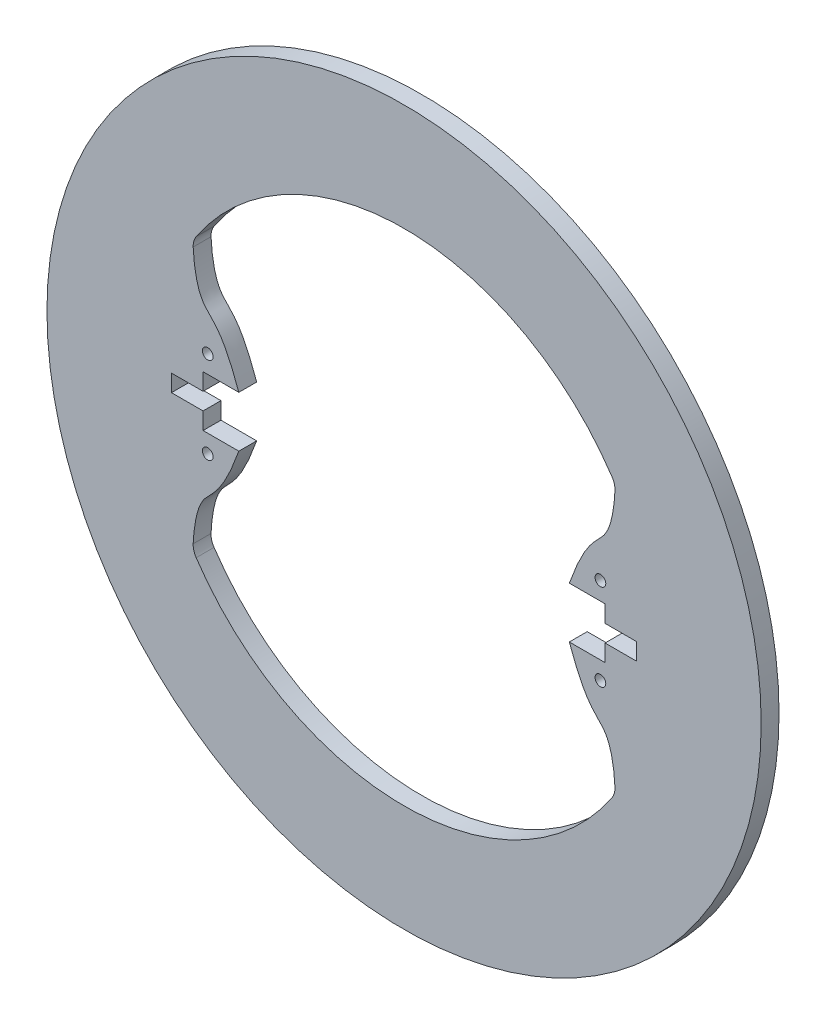
ISO-10303-21;
HEADER;
FILE_DESCRIPTION(('STEP AP214'),'2;1');
FILE_NAME('part.step','',(''),(''),'','','');
FILE_SCHEMA(('AUTOMOTIVE_DESIGN { 1 0 10303 214 1 1 1 1 }'));
ENDSEC;
DATA;
#1=APPLICATION_CONTEXT('core data for automotive mechanical design processes');
#2=APPLICATION_PROTOCOL_DEFINITION('international standard','automotive_design',2000,#1);
#3=PRODUCT_CONTEXT('',#1,'mechanical');
#4=PRODUCT('Part','Part','',(#3));
#5=PRODUCT_RELATED_PRODUCT_CATEGORY('part','',(#4));
#6=PRODUCT_DEFINITION_FORMATION('','',#4);
#7=PRODUCT_DEFINITION_CONTEXT('part definition',#1,'design');
#8=PRODUCT_DEFINITION('design','',#6,#7);
#9=PRODUCT_DEFINITION_SHAPE('','',#8);
#10=(LENGTH_UNIT() NAMED_UNIT(*) SI_UNIT(.MILLI.,.METRE.));
#11=(NAMED_UNIT(*) PLANE_ANGLE_UNIT() SI_UNIT($,.RADIAN.));
#12=(NAMED_UNIT(*) SI_UNIT($,.STERADIAN.) SOLID_ANGLE_UNIT());
#13=UNCERTAINTY_MEASURE_WITH_UNIT(LENGTH_MEASURE(1.E-05),#10,'distance_accuracy_value','');
#14=(GEOMETRIC_REPRESENTATION_CONTEXT(3) GLOBAL_UNCERTAINTY_ASSIGNED_CONTEXT((#13)) GLOBAL_UNIT_ASSIGNED_CONTEXT((#10,
#11,#12)) REPRESENTATION_CONTEXT('',''));
#15=CARTESIAN_POINT('',(0.,0.,0.));
#16=DIRECTION('',(0.,0.,1.));
#17=DIRECTION('',(1.,0.,0.));
#18=AXIS2_PLACEMENT_3D('',#15,#16,#17);
#19=CARTESIAN_POINT('',(0.,0.,5.));
#20=DIRECTION('',(0.,0.,1.));
#21=DIRECTION('',(1.,0.,0.));
#22=AXIS2_PLACEMENT_3D('',#19,#20,#21);
#23=PLANE('',#22);
#24=CARTESIAN_POINT('',(-54.9519052838332,-12.125,5.));
#25=DIRECTION('',(0.,0.,-1.));
#26=DIRECTION('',(-1.,0.,0.));
#27=AXIS2_PLACEMENT_3D('',#24,#25,#26);
#28=CIRCLE('',#27,1.5);
#29=CARTESIAN_POINT('',(-56.4519052838332,-12.125,5.));
#30=VERTEX_POINT('',#29);
#31=EDGE_CURVE('E310',#30,#30,#28,.T.);
#32=ORIENTED_EDGE('',*,*,#31,.T.);
#33=EDGE_LOOP('',(#32));
#34=FACE_BOUND('',#33,.T.);
#35=CARTESIAN_POINT('',(-54.9519052838332,12.125,5.));
#36=DIRECTION('',(0.,0.,1.));
#37=DIRECTION('',(1.,0.,0.));
#38=AXIS2_PLACEMENT_3D('',#35,#36,#37);
#39=CIRCLE('',#38,1.5);
#40=CARTESIAN_POINT('',(-53.4519052838332,12.125,5.));
#41=VERTEX_POINT('',#40);
#42=EDGE_CURVE('E308',#41,#41,#39,.T.);
#43=ORIENTED_EDGE('',*,*,#42,.F.);
#44=EDGE_LOOP('',(#43));
#45=FACE_BOUND('',#44,.T.);
#46=CARTESIAN_POINT('',(0.,0.,5.));
#47=DIRECTION('',(0.,0.,1.));
#48=DIRECTION('',(1.,0.,0.));
#49=AXIS2_PLACEMENT_3D('',#46,#47,#48);
#50=CIRCLE('',#49,99.95);
#51=CARTESIAN_POINT('',(99.95,0.,5.));
#52=VERTEX_POINT('',#51);
#53=EDGE_CURVE('E11',#52,#52,#50,.T.);
#54=ORIENTED_EDGE('',*,*,#53,.T.);
#55=EDGE_LOOP('',(#54));
#56=FACE_BOUND('',#55,.T.);
#57=DIRECTION('',(-1.,0.,0.));
#58=VECTOR('',#57,1.);
#59=CARTESIAN_POINT('',(-56.2500000000002,2.375,5.));
#60=LINE('',#59,#58);
#61=CARTESIAN_POINT('',(-56.2500000000002,2.375,5.));
#62=VERTEX_POINT('',#61);
#63=CARTESIAN_POINT('',(-65.1000000000003,2.375,5.));
#64=VERTEX_POINT('',#63);
#65=EDGE_CURVE('E209',#62,#64,#60,.T.);
#66=ORIENTED_EDGE('',*,*,#65,.F.);
#67=DIRECTION('',(0.,-1.,0.));
#68=VECTOR('',#67,1.);
#69=CARTESIAN_POINT('',(-56.2500000000002,7.125,5.));
#70=LINE('',#69,#68);
#71=CARTESIAN_POINT('',(-56.2500000000002,7.125,5.));
#72=VERTEX_POINT('',#71);
#73=EDGE_CURVE('E201',#72,#62,#70,.T.);
#74=ORIENTED_EDGE('',*,*,#73,.F.);
#75=DIRECTION('',(-1.,0.,0.));
#76=VECTOR('',#75,1.);
#77=CARTESIAN_POINT('',(-56.2500000000002,7.125,5.));
#78=LINE('',#77,#76);
#79=CARTESIAN_POINT('',(-46.25,7.125,5.));
#80=VERTEX_POINT('',#79);
#81=EDGE_CURVE('E356',#80,#72,#78,.T.);
#82=ORIENTED_EDGE('',*,*,#81,.F.);
#83=CARTESIAN_POINT('',(-59.0263284799365,35.9670995706472,5.));
#84=CARTESIAN_POINT('',(-58.7951174998396,29.1461096697323,5.));
#85=CARTESIAN_POINT('',(-56.2893390197397,16.9349751537397,5.));
#86=CARTESIAN_POINT('',(-53.9936810278316,28.8237446982578,5.));
#87=CARTESIAN_POINT('',(-46.25,7.125,5.));
#88=B_SPLINE_CURVE_WITH_KNOTS('',4,(#83,#84,#85,#86,#87),.UNSPECIFIED.,.F.,.F.,(5,5),(0.,1.),.UNSPECIFIED.);
#89=CARTESIAN_POINT('',(-59.0263284799365,35.9670995706472,5.));
#90=VERTEX_POINT('',#89);
#91=EDGE_CURVE('E350',#90,#80,#88,.T.);
#92=ORIENTED_EDGE('',*,*,#91,.F.);
#93=CARTESIAN_POINT('',(-54.0291985205795,36.1364872009411,5.));
#94=DIRECTION('',(0.,0.,1.));
#95=DIRECTION('',(1.,0.,0.));
#96=AXIS2_PLACEMENT_3D('',#93,#94,#95);
#97=CIRCLE('',#96,4.99999999999999);
#98=CARTESIAN_POINT('',(-58.1852907144704,38.9162169856289,5.));
#99=VERTEX_POINT('',#98);
#100=EDGE_CURVE('E357',#99,#90,#97,.T.);
#101=ORIENTED_EDGE('',*,*,#100,.F.);
#102=CARTESIAN_POINT('',(0.,0.,5.));
#103=DIRECTION('',(0.,0.,1.));
#104=DIRECTION('',(1.,0.,0.));
#105=AXIS2_PLACEMENT_3D('',#102,#103,#104);
#106=CIRCLE('',#105,70.);
#107=CARTESIAN_POINT('',(58.1852907144702,38.9162169856296,5.));
#108=VERTEX_POINT('',#107);
#109=EDGE_CURVE('E587',#108,#99,#106,.T.);
#110=ORIENTED_EDGE('',*,*,#109,.F.);
#111=CARTESIAN_POINT('',(54.0291985205795,36.1364872009418,5.));
#112=DIRECTION('',(0.,0.,1.));
#113=DIRECTION('',(-1.,0.,0.));
#114=AXIS2_PLACEMENT_3D('',#111,#112,#113);
#115=CIRCLE('',#114,4.99999999999999);
#116=CARTESIAN_POINT('',(59.0263284799365,35.967099570648,5.));
#117=VERTEX_POINT('',#116);
#118=EDGE_CURVE('E576',#117,#108,#115,.T.);
#119=ORIENTED_EDGE('',*,*,#118,.F.);
#120=CARTESIAN_POINT('',(46.2500000000004,7.12500000000064,5.));
#121=CARTESIAN_POINT('',(53.9936810278317,28.8237446982585,5.));
#122=CARTESIAN_POINT('',(56.28933901974,16.9349751537405,5.));
#123=CARTESIAN_POINT('',(58.7951174998397,29.1461096697332,5.));
#124=CARTESIAN_POINT('',(59.0263284799365,35.967099570648,5.));
#125=B_SPLINE_CURVE_WITH_KNOTS('',4,(#120,#121,#122,#123,#124),.UNSPECIFIED.,.F.,.F.,(5,5),(0.,
1.),.UNSPECIFIED.);
#126=CARTESIAN_POINT('',(46.2500000000004,7.12500000000064,5.));
#127=VERTEX_POINT('',#126);
#128=EDGE_CURVE('E570',#127,#117,#125,.T.);
#129=ORIENTED_EDGE('',*,*,#128,.F.);
#130=DIRECTION('',(-1.,0.,0.));
#131=VECTOR('',#130,1.);
#132=CARTESIAN_POINT('',(56.2500000000006,7.12500000000078,5.));
#133=LINE('',#132,#131);
#134=CARTESIAN_POINT('',(56.2500000000006,7.12500000000078,5.));
#135=VERTEX_POINT('',#134);
#136=EDGE_CURVE('E594',#135,#127,#133,.T.);
#137=ORIENTED_EDGE('',*,*,#136,.F.);
#138=DIRECTION('',(0.,1.,0.));
#139=VECTOR('',#138,1.);
#140=CARTESIAN_POINT('',(56.2500000000006,7.12500000000078,5.));
#141=LINE('',#140,#139);
#142=CARTESIAN_POINT('',(56.2500000000007,2.37500000000078,5.));
#143=VERTEX_POINT('',#142);
#144=EDGE_CURVE('E559',#143,#135,#141,.T.);
#145=ORIENTED_EDGE('',*,*,#144,.F.);
#146=DIRECTION('',(-1.,0.,0.));
#147=VECTOR('',#146,1.);
#148=CARTESIAN_POINT('',(56.2500000000007,2.37500000000078,5.));
#149=LINE('',#148,#147);
#150=CARTESIAN_POINT('',(65.1000000000007,2.37500000000092,5.));
#151=VERTEX_POINT('',#150);
#152=EDGE_CURVE('E553',#151,#143,#149,.T.);
#153=ORIENTED_EDGE('',*,*,#152,.F.);
#154=DIRECTION('',(0.,1.,0.));
#155=VECTOR('',#154,1.);
#156=CARTESIAN_POINT('',(65.1000000000007,2.37500000000092,5.));
#157=LINE('',#156,#155);
#158=CARTESIAN_POINT('',(65.1000000000007,-2.37500000000091,5.));
#159=VERTEX_POINT('',#158);
#160=EDGE_CURVE('E632',#159,#151,#157,.T.);
#161=ORIENTED_EDGE('',*,*,#160,.F.);
#162=DIRECTION('',(1.,0.,0.));
#163=VECTOR('',#162,1.);
#164=CARTESIAN_POINT('',(56.2500000000007,-2.37500000000078,5.));
#165=LINE('',#164,#163);
#166=CARTESIAN_POINT('',(56.2500000000007,-2.37500000000078,5.));
#167=VERTEX_POINT('',#166);
#168=EDGE_CURVE('E542',#167,#159,#165,.T.);
#169=ORIENTED_EDGE('',*,*,#168,.F.);
#170=DIRECTION('',(0.,1.,0.));
#171=VECTOR('',#170,1.);
#172=CARTESIAN_POINT('',(56.2500000000006,-7.12500000000078,5.));
#173=LINE('',#172,#171);
#174=CARTESIAN_POINT('',(56.2500000000006,-7.12500000000078,5.));
#175=VERTEX_POINT('',#174);
#176=EDGE_CURVE('E536',#175,#167,#173,.T.);
#177=ORIENTED_EDGE('',*,*,#176,.F.);
#178=DIRECTION('',(1.,0.,0.));
#179=VECTOR('',#178,1.);
#180=CARTESIAN_POINT('',(56.2500000000006,-7.12500000000078,5.));
#181=LINE('',#180,#179);
#182=CARTESIAN_POINT('',(46.2500000000004,-7.12500000000064,5.));
#183=VERTEX_POINT('',#182);
#184=EDGE_CURVE('E625',#183,#175,#181,.T.);
#185=ORIENTED_EDGE('',*,*,#184,.F.);
#186=CARTESIAN_POINT('',(59.0263284799365,-35.967099570648,5.));
#187=CARTESIAN_POINT('',(58.7951174998397,-29.1461096697332,5.));
#188=CARTESIAN_POINT('',(56.28933901974,-16.9349751537405,5.));
#189=CARTESIAN_POINT('',(53.9936810278317,-28.8237446982585,5.));
#190=CARTESIAN_POINT('',(46.2500000000004,-7.12500000000064,5.));
#191=B_SPLINE_CURVE_WITH_KNOTS('',4,(#186,#187,#188,#189,#190),.UNSPECIFIED.,.F.,.F.,(5,5),(0.,
1.),.UNSPECIFIED.);
#192=CARTESIAN_POINT('',(59.0263284799365,-35.967099570648,5.));
#193=VERTEX_POINT('',#192);
#194=EDGE_CURVE('E525',#193,#183,#191,.T.);
#195=ORIENTED_EDGE('',*,*,#194,.F.);
#196=CARTESIAN_POINT('',(54.0291985205795,-36.1364872009418,5.));
#197=DIRECTION('',(0.,0.,1.));
#198=DIRECTION('',(1.,0.,0.));
#199=AXIS2_PLACEMENT_3D('',#196,#197,#198);
#200=CIRCLE('',#199,4.99999999999999);
#201=CARTESIAN_POINT('',(58.1852907144711,-38.9162169856279,5.));
#202=VERTEX_POINT('',#201);
#203=EDGE_CURVE('E519',#202,#193,#200,.T.);
#204=ORIENTED_EDGE('',*,*,#203,.F.);
#205=CARTESIAN_POINT('',(0.,0.,5.));
#206=DIRECTION('',(0.,0.,1.));
#207=DIRECTION('',(1.,0.,0.));
#208=AXIS2_PLACEMENT_3D('',#205,#206,#207);
#209=CIRCLE('',#208,70.);
#210=CARTESIAN_POINT('',(-58.1852907144703,-38.9162169856288,5.));
#211=VERTEX_POINT('',#210);
#212=EDGE_CURVE('E634',#211,#202,#209,.T.);
#213=ORIENTED_EDGE('',*,*,#212,.F.);
#214=CARTESIAN_POINT('',(-54.0291985205795,-36.1364872009411,5.));
#215=DIRECTION('',(0.,0.,1.));
#216=DIRECTION('',(-1.,0.,0.));
#217=AXIS2_PLACEMENT_3D('',#214,#215,#216);
#218=CIRCLE('',#217,4.99999999999999);
#219=CARTESIAN_POINT('',(-59.0263284799365,-35.9670995706472,5.));
#220=VERTEX_POINT('',#219);
#221=EDGE_CURVE('E238',#220,#211,#218,.T.);
#222=ORIENTED_EDGE('',*,*,#221,.F.);
#223=CARTESIAN_POINT('',(-46.25,-7.125,5.));
#224=CARTESIAN_POINT('',(-53.9936810278316,-28.8237446982578,5.));
#225=CARTESIAN_POINT('',(-56.2893390197397,-16.9349751537397,5.));
#226=CARTESIAN_POINT('',(-58.7951174998396,-29.1461096697323,5.));
#227=CARTESIAN_POINT('',(-59.0263284799365,-35.9670995706472,5.));
#228=B_SPLINE_CURVE_WITH_KNOTS('',4,(#223,#224,#225,#226,#227),.UNSPECIFIED.,.F.,.F.,(5,5),(0.,
1.),.UNSPECIFIED.);
#229=CARTESIAN_POINT('',(-46.25,-7.125,5.));
#230=VERTEX_POINT('',#229);
#231=EDGE_CURVE('E233',#230,#220,#228,.T.);
#232=ORIENTED_EDGE('',*,*,#231,.F.);
#233=DIRECTION('',(1.,0.,0.));
#234=VECTOR('',#233,1.);
#235=CARTESIAN_POINT('',(-56.2500000000002,-7.125,5.));
#236=LINE('',#235,#234);
#237=CARTESIAN_POINT('',(-56.2500000000002,-7.125,5.));
#238=VERTEX_POINT('',#237);
#239=EDGE_CURVE('E231',#238,#230,#236,.T.);
#240=ORIENTED_EDGE('',*,*,#239,.F.);
#241=DIRECTION('',(0.,-1.,0.));
#242=VECTOR('',#241,1.);
#243=CARTESIAN_POINT('',(-56.2500000000002,-7.125,5.));
#244=LINE('',#243,#242);
#245=CARTESIAN_POINT('',(-56.2500000000002,-2.375,5.));
#246=VERTEX_POINT('',#245);
#247=EDGE_CURVE('E229',#246,#238,#244,.T.);
#248=ORIENTED_EDGE('',*,*,#247,.F.);
#249=DIRECTION('',(1.,0.,0.));
#250=VECTOR('',#249,1.);
#251=CARTESIAN_POINT('',(-56.2500000000002,-2.375,5.));
#252=LINE('',#251,#250);
#253=CARTESIAN_POINT('',(-65.1000000000003,-2.375,5.));
#254=VERTEX_POINT('',#253);
#255=EDGE_CURVE('E224',#254,#246,#252,.T.);
#256=ORIENTED_EDGE('',*,*,#255,.F.);
#257=DIRECTION('',(0.,-1.,0.));
#258=VECTOR('',#257,1.);
#259=CARTESIAN_POINT('',(-65.1000000000003,2.375,5.));
#260=LINE('',#259,#258);
#261=EDGE_CURVE('E222',#64,#254,#260,.T.);
#262=ORIENTED_EDGE('',*,*,#261,.F.);
#263=EDGE_LOOP('',(#66,#74,#82,#92,#101,#110,#119,#129,#137,#145,#153,#161,#169,#177,#185,#195,
#204,#213,#222,#232,#240,#248,#256,#262));
#264=FACE_BOUND('',#263,.T.);
#265=CARTESIAN_POINT('',(54.9519052838332,-12.125,5.));
#266=DIRECTION('',(0.,0.,1.));
#267=DIRECTION('',(1.,0.,0.));
#268=AXIS2_PLACEMENT_3D('',#265,#266,#267);
#269=CIRCLE('',#268,1.5);
#270=CARTESIAN_POINT('',(56.4519052838332,-12.125,5.));
#271=VERTEX_POINT('',#270);
#272=EDGE_CURVE('E316',#271,#271,#269,.T.);
#273=ORIENTED_EDGE('',*,*,#272,.F.);
#274=EDGE_LOOP('',(#273));
#275=FACE_BOUND('',#274,.T.);
#276=CARTESIAN_POINT('',(54.9519052838332,12.125,5.));
#277=DIRECTION('',(0.,0.,-1.));
#278=DIRECTION('',(-1.,0.,0.));
#279=AXIS2_PLACEMENT_3D('',#276,#277,#278);
#280=CIRCLE('',#279,1.5);
#281=CARTESIAN_POINT('',(53.4519052838332,12.125,5.));
#282=VERTEX_POINT('',#281);
#283=EDGE_CURVE('E302',#282,#282,#280,.T.);
#284=ORIENTED_EDGE('',*,*,#283,.T.);
#285=EDGE_LOOP('',(#284));
#286=FACE_BOUND('',#285,.T.);
#287=ADVANCED_FACE('F40',(#34,#45,#56,#264,#275,#286),#23,.T.);
#288=CARTESIAN_POINT('',(0.,0.,0.));
#289=DIRECTION('',(0.,0.,1.));
#290=DIRECTION('',(1.,0.,0.));
#291=AXIS2_PLACEMENT_3D('',#288,#289,#290);
#292=PLANE('',#291);
#293=CARTESIAN_POINT('',(54.9519052838332,-12.125,0.));
#294=DIRECTION('',(0.,0.,1.));
#295=DIRECTION('',(1.,0.,0.));
#296=AXIS2_PLACEMENT_3D('',#293,#294,#295);
#297=CIRCLE('',#296,1.5);
#298=CARTESIAN_POINT('',(56.4519052838332,-12.125,0.));
#299=VERTEX_POINT('',#298);
#300=EDGE_CURVE('E284',#299,#299,#297,.T.);
#301=ORIENTED_EDGE('',*,*,#300,.T.);
#302=EDGE_LOOP('',(#301));
#303=FACE_BOUND('',#302,.T.);
#304=CARTESIAN_POINT('',(-54.9519052838332,12.125,0.));
#305=DIRECTION('',(0.,0.,1.));
#306=DIRECTION('',(1.,0.,0.));
#307=AXIS2_PLACEMENT_3D('',#304,#305,#306);
#308=CIRCLE('',#307,1.5);
#309=CARTESIAN_POINT('',(-53.4519052838332,12.125,0.));
#310=VERTEX_POINT('',#309);
#311=EDGE_CURVE('E288',#310,#310,#308,.T.);
#312=ORIENTED_EDGE('',*,*,#311,.T.);
#313=EDGE_LOOP('',(#312));
#314=FACE_BOUND('',#313,.T.);
#315=CARTESIAN_POINT('',(0.,0.,0.));
#316=DIRECTION('',(0.,0.,1.));
#317=DIRECTION('',(1.,0.,0.));
#318=AXIS2_PLACEMENT_3D('',#315,#316,#317);
#319=CIRCLE('',#318,99.95);
#320=CARTESIAN_POINT('',(99.95,0.,0.));
#321=VERTEX_POINT('',#320);
#322=EDGE_CURVE('E44',#321,#321,#319,.T.);
#323=ORIENTED_EDGE('',*,*,#322,.F.);
#324=EDGE_LOOP('',(#323));
#325=FACE_BOUND('',#324,.T.);
#326=DIRECTION('',(0.,-1.,0.));
#327=VECTOR('',#326,1.);
#328=CARTESIAN_POINT('',(-56.2500000000002,7.125,0.));
#329=LINE('',#328,#327);
#330=CARTESIAN_POINT('',(-56.2500000000002,7.125,0.));
#331=VERTEX_POINT('',#330);
#332=CARTESIAN_POINT('',(-56.2500000000002,2.375,0.));
#333=VERTEX_POINT('',#332);
#334=EDGE_CURVE('E63',#331,#333,#329,.T.);
#335=ORIENTED_EDGE('',*,*,#334,.T.);
#336=DIRECTION('',(-1.,0.,0.));
#337=VECTOR('',#336,1.);
#338=CARTESIAN_POINT('',(-56.2500000000002,2.375,0.));
#339=LINE('',#338,#337);
#340=CARTESIAN_POINT('',(-65.1000000000003,2.375,0.));
#341=VERTEX_POINT('',#340);
#342=EDGE_CURVE('E216',#333,#341,#339,.T.);
#343=ORIENTED_EDGE('',*,*,#342,.T.);
#344=DIRECTION('',(0.,-1.,0.));
#345=VECTOR('',#344,1.);
#346=CARTESIAN_POINT('',(-65.1000000000003,2.375,0.));
#347=LINE('',#346,#345);
#348=CARTESIAN_POINT('',(-65.1000000000003,-2.375,0.));
#349=VERTEX_POINT('',#348);
#350=EDGE_CURVE('E365',#341,#349,#347,.T.);
#351=ORIENTED_EDGE('',*,*,#350,.T.);
#352=DIRECTION('',(1.,0.,0.));
#353=VECTOR('',#352,1.);
#354=CARTESIAN_POINT('',(-56.2500000000002,-2.375,0.));
#355=LINE('',#354,#353);
#356=CARTESIAN_POINT('',(-56.2500000000002,-2.375,0.));
#357=VERTEX_POINT('',#356);
#358=EDGE_CURVE('E368',#349,#357,#355,.T.);
#359=ORIENTED_EDGE('',*,*,#358,.T.);
#360=DIRECTION('',(0.,-1.,0.));
#361=VECTOR('',#360,1.);
#362=CARTESIAN_POINT('',(-56.2500000000002,-7.125,0.));
#363=LINE('',#362,#361);
#364=CARTESIAN_POINT('',(-56.2500000000002,-7.125,0.));
#365=VERTEX_POINT('',#364);
#366=EDGE_CURVE('E371',#357,#365,#363,.T.);
#367=ORIENTED_EDGE('',*,*,#366,.T.);
#368=DIRECTION('',(1.,0.,0.));
#369=VECTOR('',#368,1.);
#370=CARTESIAN_POINT('',(-56.2500000000002,-7.125,0.));
#371=LINE('',#370,#369);
#372=CARTESIAN_POINT('',(-46.25,-7.125,0.));
#373=VERTEX_POINT('',#372);
#374=EDGE_CURVE('E374',#365,#373,#371,.T.);
#375=ORIENTED_EDGE('',*,*,#374,.T.);
#376=CARTESIAN_POINT('',(-46.25,-7.125,0.));
#377=CARTESIAN_POINT('',(-53.9936810278316,-28.8237446982578,0.));
#378=CARTESIAN_POINT('',(-56.2893390197397,-16.9349751537397,0.));
#379=CARTESIAN_POINT('',(-58.7951174998396,-29.1461096697323,0.));
#380=CARTESIAN_POINT('',(-59.0263284799365,-35.9670995706472,0.));
#381=B_SPLINE_CURVE_WITH_KNOTS('',4,(#376,#377,#378,#379,#380),.UNSPECIFIED.,.F.,.F.,(5,5),(0.,
1.),.UNSPECIFIED.);
#382=CARTESIAN_POINT('',(-59.0263284799365,-35.9670995706472,0.));
#383=VERTEX_POINT('',#382);
#384=EDGE_CURVE('E377',#373,#383,#381,.T.);
#385=ORIENTED_EDGE('',*,*,#384,.T.);
#386=CARTESIAN_POINT('',(-54.0291985205795,-36.1364872009411,0.));
#387=DIRECTION('',(0.,0.,1.));
#388=DIRECTION('',(-1.,0.,0.));
#389=AXIS2_PLACEMENT_3D('',#386,#387,#388);
#390=CIRCLE('',#389,4.99999999999999);
#391=CARTESIAN_POINT('',(-58.1852907144703,-38.9162169856288,0.));
#392=VERTEX_POINT('',#391);
#393=EDGE_CURVE('E382',#383,#392,#390,.T.);
#394=ORIENTED_EDGE('',*,*,#393,.T.);
#395=CARTESIAN_POINT('',(0.,0.,0.));
#396=DIRECTION('',(0.,0.,1.));
#397=DIRECTION('',(1.,0.,0.));
#398=AXIS2_PLACEMENT_3D('',#395,#396,#397);
#399=CIRCLE('',#398,70.);
#400=CARTESIAN_POINT('',(58.1852907144711,-38.9162169856279,0.));
#401=VERTEX_POINT('',#400);
#402=EDGE_CURVE('E388',#392,#401,#399,.T.);
#403=ORIENTED_EDGE('',*,*,#402,.T.);
#404=CARTESIAN_POINT('',(54.0291985205795,-36.1364872009418,0.));
#405=DIRECTION('',(0.,0.,1.));
#406=DIRECTION('',(1.,0.,0.));
#407=AXIS2_PLACEMENT_3D('',#404,#405,#406);
#408=CIRCLE('',#407,4.99999999999999);
#409=CARTESIAN_POINT('',(59.0263284799365,-35.967099570648,0.));
#410=VERTEX_POINT('',#409);
#411=EDGE_CURVE('E391',#401,#410,#408,.T.);
#412=ORIENTED_EDGE('',*,*,#411,.T.);
#413=CARTESIAN_POINT('',(59.0263284799365,-35.967099570648,0.));
#414=CARTESIAN_POINT('',(58.7951174998397,-29.1461096697332,0.));
#415=CARTESIAN_POINT('',(56.28933901974,-16.9349751537405,0.));
#416=CARTESIAN_POINT('',(53.9936810278317,-28.8237446982585,0.));
#417=CARTESIAN_POINT('',(46.2500000000004,-7.12500000000064,0.));
#418=B_SPLINE_CURVE_WITH_KNOTS('',4,(#413,#414,#415,#416,#417),.UNSPECIFIED.,.F.,.F.,(5,5),(0.,
1.),.UNSPECIFIED.);
#419=CARTESIAN_POINT('',(46.2500000000004,-7.12500000000064,0.));
#420=VERTEX_POINT('',#419);
#421=EDGE_CURVE('E394',#410,#420,#418,.T.);
#422=ORIENTED_EDGE('',*,*,#421,.T.);
#423=DIRECTION('',(1.,0.,0.));
#424=VECTOR('',#423,1.);
#425=CARTESIAN_POINT('',(56.2500000000006,-7.12500000000078,0.));
#426=LINE('',#425,#424);
#427=CARTESIAN_POINT('',(56.2500000000006,-7.12500000000078,0.));
#428=VERTEX_POINT('',#427);
#429=EDGE_CURVE('E399',#420,#428,#426,.T.);
#430=ORIENTED_EDGE('',*,*,#429,.T.);
#431=DIRECTION('',(0.,1.,0.));
#432=VECTOR('',#431,1.);
#433=CARTESIAN_POINT('',(56.2500000000006,-7.12500000000078,0.));
#434=LINE('',#433,#432);
#435=CARTESIAN_POINT('',(56.2500000000007,-2.37500000000078,0.));
#436=VERTEX_POINT('',#435);
#437=EDGE_CURVE('E405',#428,#436,#434,.T.);
#438=ORIENTED_EDGE('',*,*,#437,.T.);
#439=DIRECTION('',(1.,0.,0.));
#440=VECTOR('',#439,1.);
#441=CARTESIAN_POINT('',(56.2500000000007,-2.37500000000078,0.));
#442=LINE('',#441,#440);
#443=CARTESIAN_POINT('',(65.1000000000007,-2.37500000000091,0.));
#444=VERTEX_POINT('',#443);
#445=EDGE_CURVE('E408',#436,#444,#442,.T.);
#446=ORIENTED_EDGE('',*,*,#445,.T.);
#447=DIRECTION('',(0.,1.,0.));
#448=VECTOR('',#447,1.);
#449=CARTESIAN_POINT('',(65.1000000000007,2.37500000000092,0.));
#450=LINE('',#449,#448);
#451=CARTESIAN_POINT('',(65.1000000000007,2.37500000000092,0.));
#452=VERTEX_POINT('',#451);
#453=EDGE_CURVE('E411',#444,#452,#450,.T.);
#454=ORIENTED_EDGE('',*,*,#453,.T.);
#455=DIRECTION('',(-1.,0.,0.));
#456=VECTOR('',#455,1.);
#457=CARTESIAN_POINT('',(56.2500000000007,2.37500000000078,0.));
#458=LINE('',#457,#456);
#459=CARTESIAN_POINT('',(56.2500000000007,2.37500000000078,0.));
#460=VERTEX_POINT('',#459);
#461=EDGE_CURVE('E414',#452,#460,#458,.T.);
#462=ORIENTED_EDGE('',*,*,#461,.T.);
#463=DIRECTION('',(0.,1.,0.));
#464=VECTOR('',#463,1.);
#465=CARTESIAN_POINT('',(56.2500000000006,7.12500000000078,0.));
#466=LINE('',#465,#464);
#467=CARTESIAN_POINT('',(56.2500000000006,7.12500000000078,0.));
#468=VERTEX_POINT('',#467);
#469=EDGE_CURVE('E417',#460,#468,#466,.T.);
#470=ORIENTED_EDGE('',*,*,#469,.T.);
#471=DIRECTION('',(-1.,0.,0.));
#472=VECTOR('',#471,1.);
#473=CARTESIAN_POINT('',(56.2500000000006,7.12500000000078,0.));
#474=LINE('',#473,#472);
#475=CARTESIAN_POINT('',(46.2500000000004,7.12500000000064,0.));
#476=VERTEX_POINT('',#475);
#477=EDGE_CURVE('E420',#468,#476,#474,.T.);
#478=ORIENTED_EDGE('',*,*,#477,.T.);
#479=CARTESIAN_POINT('',(46.2500000000004,7.12500000000064,0.));
#480=CARTESIAN_POINT('',(53.9936810278317,28.8237446982585,0.));
#481=CARTESIAN_POINT('',(56.28933901974,16.9349751537405,0.));
#482=CARTESIAN_POINT('',(58.7951174998397,29.1461096697332,0.));
#483=CARTESIAN_POINT('',(59.0263284799365,35.967099570648,0.));
#484=B_SPLINE_CURVE_WITH_KNOTS('',4,(#479,#480,#481,#482,#483),.UNSPECIFIED.,.F.,.F.,(5,5),(0.,
1.),.UNSPECIFIED.);
#485=CARTESIAN_POINT('',(59.0263284799365,35.967099570648,0.));
#486=VERTEX_POINT('',#485);
#487=EDGE_CURVE('E423',#476,#486,#484,.T.);
#488=ORIENTED_EDGE('',*,*,#487,.T.);
#489=CARTESIAN_POINT('',(54.0291985205795,36.1364872009418,0.));
#490=DIRECTION('',(0.,0.,1.));
#491=DIRECTION('',(-1.,0.,0.));
#492=AXIS2_PLACEMENT_3D('',#489,#490,#491);
#493=CIRCLE('',#492,4.99999999999999);
#494=CARTESIAN_POINT('',(58.1852907144702,38.9162169856296,0.));
#495=VERTEX_POINT('',#494);
#496=EDGE_CURVE('E428',#486,#495,#493,.T.);
#497=ORIENTED_EDGE('',*,*,#496,.T.);
#498=CARTESIAN_POINT('',(0.,0.,0.));
#499=DIRECTION('',(0.,0.,1.));
#500=DIRECTION('',(1.,0.,0.));
#501=AXIS2_PLACEMENT_3D('',#498,#499,#500);
#502=CIRCLE('',#501,70.);
#503=CARTESIAN_POINT('',(-58.1852907144704,38.9162169856289,0.));
#504=VERTEX_POINT('',#503);
#505=EDGE_CURVE('E434',#495,#504,#502,.T.);
#506=ORIENTED_EDGE('',*,*,#505,.T.);
#507=CARTESIAN_POINT('',(-54.0291985205795,36.1364872009411,0.));
#508=DIRECTION('',(0.,0.,1.));
#509=DIRECTION('',(1.,0.,0.));
#510=AXIS2_PLACEMENT_3D('',#507,#508,#509);
#511=CIRCLE('',#510,4.99999999999999);
#512=CARTESIAN_POINT('',(-59.0263284799365,35.9670995706472,0.));
#513=VERTEX_POINT('',#512);
#514=EDGE_CURVE('E437',#504,#513,#511,.T.);
#515=ORIENTED_EDGE('',*,*,#514,.T.);
#516=CARTESIAN_POINT('',(-59.0263284799365,35.9670995706472,0.));
#517=CARTESIAN_POINT('',(-58.7951174998396,29.1461096697323,0.));
#518=CARTESIAN_POINT('',(-56.2893390197397,16.9349751537397,0.));
#519=CARTESIAN_POINT('',(-53.9936810278316,28.8237446982578,0.));
#520=CARTESIAN_POINT('',(-46.25,7.125,0.));
#521=B_SPLINE_CURVE_WITH_KNOTS('',4,(#516,#517,#518,#519,#520),.UNSPECIFIED.,.F.,.F.,(5,5),(0.,
1.),.UNSPECIFIED.);
#522=CARTESIAN_POINT('',(-46.25,7.125,0.));
#523=VERTEX_POINT('',#522);
#524=EDGE_CURVE('E440',#513,#523,#521,.T.);
#525=ORIENTED_EDGE('',*,*,#524,.T.);
#526=DIRECTION('',(-1.,0.,0.));
#527=VECTOR('',#526,1.);
#528=CARTESIAN_POINT('',(-56.2500000000002,7.125,0.));
#529=LINE('',#528,#527);
#530=EDGE_CURVE('E210',#523,#331,#529,.T.);
#531=ORIENTED_EDGE('',*,*,#530,.T.);
#532=EDGE_LOOP('',(#335,#343,#351,#359,#367,#375,#385,#394,#403,#412,#422,#430,#438,#446,#454,
#462,#470,#478,#488,#497,#506,#515,#525,#531));
#533=FACE_BOUND('',#532,.T.);
#534=CARTESIAN_POINT('',(-54.9519052838332,-12.125,0.));
#535=DIRECTION('',(0.,0.,-1.));
#536=DIRECTION('',(-1.,0.,0.));
#537=AXIS2_PLACEMENT_3D('',#534,#535,#536);
#538=CIRCLE('',#537,1.5);
#539=CARTESIAN_POINT('',(-56.4519052838332,-12.125,0.));
#540=VERTEX_POINT('',#539);
#541=EDGE_CURVE('E297',#540,#540,#538,.T.);
#542=ORIENTED_EDGE('',*,*,#541,.F.);
#543=EDGE_LOOP('',(#542));
#544=FACE_BOUND('',#543,.T.);
#545=CARTESIAN_POINT('',(54.9519052838332,12.125,0.));
#546=DIRECTION('',(0.,0.,-1.));
#547=DIRECTION('',(-1.,0.,0.));
#548=AXIS2_PLACEMENT_3D('',#545,#546,#547);
#549=CIRCLE('',#548,1.5);
#550=CARTESIAN_POINT('',(53.4519052838332,12.125,0.));
#551=VERTEX_POINT('',#550);
#552=EDGE_CURVE('E300',#551,#551,#549,.T.);
#553=ORIENTED_EDGE('',*,*,#552,.F.);
#554=EDGE_LOOP('',(#553));
#555=FACE_BOUND('',#554,.T.);
#556=ADVANCED_FACE('F272',(#303,#314,#325,#533,#544,#555),#292,.F.);
#557=CARTESIAN_POINT('',(0.,0.,5.));
#558=DIRECTION('',(0.,0.,-1.));
#559=DIRECTION('',(-1.,0.,0.));
#560=AXIS2_PLACEMENT_3D('',#557,#558,#559);
#561=CYLINDRICAL_SURFACE('',#560,99.95);
#562=ORIENTED_EDGE('',*,*,#53,.F.);
#563=EDGE_LOOP('',(#562));
#564=FACE_BOUND('',#563,.T.);
#565=ORIENTED_EDGE('',*,*,#322,.T.);
#566=EDGE_LOOP('',(#565));
#567=FACE_BOUND('',#566,.T.);
#568=ADVANCED_FACE('F42',(#564,#567),#561,.T.);
#569=CARTESIAN_POINT('',(-56.2500000000002,7.125,5.));
#570=DIRECTION('',(1.,0.,0.));
#571=DIRECTION('',(0.,0.,-1.));
#572=AXIS2_PLACEMENT_3D('',#569,#570,#571);
#573=PLANE('',#572);
#574=ORIENTED_EDGE('',*,*,#334,.F.);
#575=DIRECTION('',(0.,0.,-1.));
#576=VECTOR('',#575,1.);
#577=CARTESIAN_POINT('',(-56.2500000000002,7.125,5.));
#578=LINE('',#577,#576);
#579=EDGE_CURVE('E205',#72,#331,#578,.T.);
#580=ORIENTED_EDGE('',*,*,#579,.F.);
#581=ORIENTED_EDGE('',*,*,#73,.T.);
#582=DIRECTION('',(0.,0.,-1.));
#583=VECTOR('',#582,1.);
#584=CARTESIAN_POINT('',(-56.2500000000002,2.375,5.));
#585=LINE('',#584,#583);
#586=EDGE_CURVE('E204',#62,#333,#585,.T.);
#587=ORIENTED_EDGE('',*,*,#586,.T.);
#588=EDGE_LOOP('',(#574,#580,#581,#587));
#589=FACE_BOUND('',#588,.T.);
#590=ADVANCED_FACE('F203',(#589),#573,.T.);
#591=CARTESIAN_POINT('',(-56.2500000000002,2.375,5.));
#592=DIRECTION('',(0.,-1.,0.));
#593=DIRECTION('',(1.,0.,0.));
#594=AXIS2_PLACEMENT_3D('',#591,#592,#593);
#595=PLANE('',#594);
#596=ORIENTED_EDGE('',*,*,#342,.F.);
#597=ORIENTED_EDGE('',*,*,#586,.F.);
#598=ORIENTED_EDGE('',*,*,#65,.T.);
#599=DIRECTION('',(0.,0.,-1.));
#600=VECTOR('',#599,1.);
#601=CARTESIAN_POINT('',(-65.1000000000003,2.375,5.));
#602=LINE('',#601,#600);
#603=EDGE_CURVE('E217',#64,#341,#602,.T.);
#604=ORIENTED_EDGE('',*,*,#603,.T.);
#605=EDGE_LOOP('',(#596,#597,#598,#604));
#606=FACE_BOUND('',#605,.T.);
#607=ADVANCED_FACE('F213',(#606),#595,.T.);
#608=CARTESIAN_POINT('',(-65.1000000000003,2.375,5.));
#609=DIRECTION('',(1.,0.,0.));
#610=DIRECTION('',(0.,0.,-1.));
#611=AXIS2_PLACEMENT_3D('',#608,#609,#610);
#612=PLANE('',#611);
#613=ORIENTED_EDGE('',*,*,#350,.F.);
#614=ORIENTED_EDGE('',*,*,#603,.F.);
#615=ORIENTED_EDGE('',*,*,#261,.T.);
#616=DIRECTION('',(0.,0.,-1.));
#617=VECTOR('',#616,1.);
#618=CARTESIAN_POINT('',(-65.1000000000003,-2.375,5.));
#619=LINE('',#618,#617);
#620=EDGE_CURVE('E489',#254,#349,#619,.T.);
#621=ORIENTED_EDGE('',*,*,#620,.T.);
#622=EDGE_LOOP('',(#613,#614,#615,#621));
#623=FACE_BOUND('',#622,.T.);
#624=ADVANCED_FACE('F262',(#623),#612,.T.);
#625=CARTESIAN_POINT('',(-56.2500000000002,-2.375,5.));
#626=DIRECTION('',(0.,1.,0.));
#627=DIRECTION('',(-1.,0.,0.));
#628=AXIS2_PLACEMENT_3D('',#625,#626,#627);
#629=PLANE('',#628);
#630=ORIENTED_EDGE('',*,*,#358,.F.);
#631=ORIENTED_EDGE('',*,*,#620,.F.);
#632=ORIENTED_EDGE('',*,*,#255,.T.);
#633=DIRECTION('',(0.,0.,-1.));
#634=VECTOR('',#633,1.);
#635=CARTESIAN_POINT('',(-56.2500000000002,-2.375,5.));
#636=LINE('',#635,#634);
#637=EDGE_CURVE('E487',#246,#357,#636,.T.);
#638=ORIENTED_EDGE('',*,*,#637,.T.);
#639=EDGE_LOOP('',(#630,#631,#632,#638));
#640=FACE_BOUND('',#639,.T.);
#641=ADVANCED_FACE('F258',(#640),#629,.T.);
#642=CARTESIAN_POINT('',(-56.2500000000002,-7.125,5.));
#643=DIRECTION('',(1.,0.,0.));
#644=DIRECTION('',(0.,0.,-1.));
#645=AXIS2_PLACEMENT_3D('',#642,#643,#644);
#646=PLANE('',#645);
#647=ORIENTED_EDGE('',*,*,#366,.F.);
#648=ORIENTED_EDGE('',*,*,#637,.F.);
#649=ORIENTED_EDGE('',*,*,#247,.T.);
#650=DIRECTION('',(0.,0.,-1.));
#651=VECTOR('',#650,1.);
#652=CARTESIAN_POINT('',(-56.2500000000002,-7.125,5.));
#653=LINE('',#652,#651);
#654=EDGE_CURVE('E485',#238,#365,#653,.T.);
#655=ORIENTED_EDGE('',*,*,#654,.T.);
#656=EDGE_LOOP('',(#647,#648,#649,#655));
#657=FACE_BOUND('',#656,.T.);
#658=ADVANCED_FACE('F254',(#657),#646,.T.);
#659=CARTESIAN_POINT('',(-56.2500000000002,-7.125,5.));
#660=DIRECTION('',(0.,1.,0.));
#661=DIRECTION('',(0.,0.,1.));
#662=AXIS2_PLACEMENT_3D('',#659,#660,#661);
#663=PLANE('',#662);
#664=ORIENTED_EDGE('',*,*,#374,.F.);
#665=ORIENTED_EDGE('',*,*,#654,.F.);
#666=ORIENTED_EDGE('',*,*,#239,.T.);
#667=DIRECTION('',(0.,0.,-1.));
#668=VECTOR('',#667,1.);
#669=CARTESIAN_POINT('',(-46.25,-7.125,5.));
#670=LINE('',#669,#668);
#671=EDGE_CURVE('E483',#230,#373,#670,.T.);
#672=ORIENTED_EDGE('',*,*,#671,.T.);
#673=EDGE_LOOP('',(#664,#665,#666,#672));
#674=FACE_BOUND('',#673,.T.);
#675=ADVANCED_FACE('F249',(#674),#663,.T.);
#676=DIRECTION('',(0.,0.,-1.));
#677=VECTOR('',#676,1.);
#678=SURFACE_OF_LINEAR_EXTRUSION('',#228,#677);
#679=ORIENTED_EDGE('',*,*,#384,.F.);
#680=ORIENTED_EDGE('',*,*,#671,.F.);
#681=ORIENTED_EDGE('',*,*,#231,.T.);
#682=DIRECTION('',(0.,0.,-1.));
#683=VECTOR('',#682,1.);
#684=CARTESIAN_POINT('',(-59.0263284799365,-35.9670995706472,5.));
#685=LINE('',#684,#683);
#686=EDGE_CURVE('E481',#220,#383,#685,.T.);
#687=ORIENTED_EDGE('',*,*,#686,.T.);
#688=EDGE_LOOP('',(#679,#680,#681,#687));
#689=FACE_BOUND('',#688,.T.);
#690=ADVANCED_FACE('F244',(#689),#678,.T.);
#691=CARTESIAN_POINT('',(-54.0291985205795,-36.1364872009411,5.));
#692=DIRECTION('',(0.,0.,-1.));
#693=DIRECTION('',(-1.,0.,0.));
#694=AXIS2_PLACEMENT_3D('',#691,#692,#693);
#695=CYLINDRICAL_SURFACE('',#694,4.99999999999999);
#696=ORIENTED_EDGE('',*,*,#393,.F.);
#697=ORIENTED_EDGE('',*,*,#686,.F.);
#698=ORIENTED_EDGE('',*,*,#221,.T.);
#699=DIRECTION('',(0.,0.,-1.));
#700=VECTOR('',#699,1.);
#701=CARTESIAN_POINT('',(-58.1852907144703,-38.9162169856288,5.));
#702=LINE('',#701,#700);
#703=EDGE_CURVE('E479',#211,#392,#702,.T.);
#704=ORIENTED_EDGE('',*,*,#703,.T.);
#705=EDGE_LOOP('',(#696,#697,#698,#704));
#706=FACE_BOUND('',#705,.T.);
#707=ADVANCED_FACE('F248',(#706),#695,.F.);
#708=CARTESIAN_POINT('',(0.,0.,5.));
#709=DIRECTION('',(0.,0.,-1.));
#710=DIRECTION('',(-1.,0.,0.));
#711=AXIS2_PLACEMENT_3D('',#708,#709,#710);
#712=CYLINDRICAL_SURFACE('',#711,70.);
#713=ORIENTED_EDGE('',*,*,#402,.F.);
#714=ORIENTED_EDGE('',*,*,#703,.F.);
#715=ORIENTED_EDGE('',*,*,#212,.T.);
#716=DIRECTION('',(0.,0.,-1.));
#717=VECTOR('',#716,1.);
#718=CARTESIAN_POINT('',(58.1852907144711,-38.9162169856279,5.));
#719=LINE('',#718,#717);
#720=EDGE_CURVE('E477',#202,#401,#719,.T.);
#721=ORIENTED_EDGE('',*,*,#720,.T.);
#722=EDGE_LOOP('',(#713,#714,#715,#721));
#723=FACE_BOUND('',#722,.T.);
#724=ADVANCED_FACE('F511',(#723),#712,.F.);
#725=CARTESIAN_POINT('',(54.0291985205795,-36.1364872009418,5.));
#726=DIRECTION('',(0.,0.,-1.));
#727=DIRECTION('',(-1.,0.,0.));
#728=AXIS2_PLACEMENT_3D('',#725,#726,#727);
#729=CYLINDRICAL_SURFACE('',#728,4.99999999999999);
#730=ORIENTED_EDGE('',*,*,#411,.F.);
#731=ORIENTED_EDGE('',*,*,#720,.F.);
#732=ORIENTED_EDGE('',*,*,#203,.T.);
#733=DIRECTION('',(0.,0.,-1.));
#734=VECTOR('',#733,1.);
#735=CARTESIAN_POINT('',(59.0263284799365,-35.967099570648,5.));
#736=LINE('',#735,#734);
#737=EDGE_CURVE('E475',#193,#410,#736,.T.);
#738=ORIENTED_EDGE('',*,*,#737,.T.);
#739=EDGE_LOOP('',(#730,#731,#732,#738));
#740=FACE_BOUND('',#739,.T.);
#741=ADVANCED_FACE('F516',(#740),#729,.F.);
#742=DIRECTION('',(0.,0.,-1.));
#743=VECTOR('',#742,1.);
#744=SURFACE_OF_LINEAR_EXTRUSION('',#191,#743);
#745=ORIENTED_EDGE('',*,*,#421,.F.);
#746=ORIENTED_EDGE('',*,*,#737,.F.);
#747=ORIENTED_EDGE('',*,*,#194,.T.);
#748=DIRECTION('',(0.,0.,-1.));
#749=VECTOR('',#748,1.);
#750=CARTESIAN_POINT('',(46.2500000000004,-7.12500000000064,5.));
#751=LINE('',#750,#749);
#752=EDGE_CURVE('E473',#183,#420,#751,.T.);
#753=ORIENTED_EDGE('',*,*,#752,.T.);
#754=EDGE_LOOP('',(#745,#746,#747,#753));
#755=FACE_BOUND('',#754,.T.);
#756=ADVANCED_FACE('F522',(#755),#744,.T.);
#757=CARTESIAN_POINT('',(56.2500000000006,-7.12500000000078,5.));
#758=DIRECTION('',(0.,1.,0.));
#759=DIRECTION('',(-1.,0.,0.));
#760=AXIS2_PLACEMENT_3D('',#757,#758,#759);
#761=PLANE('',#760);
#762=ORIENTED_EDGE('',*,*,#429,.F.);
#763=ORIENTED_EDGE('',*,*,#752,.F.);
#764=ORIENTED_EDGE('',*,*,#184,.T.);
#765=DIRECTION('',(0.,0.,-1.));
#766=VECTOR('',#765,1.);
#767=CARTESIAN_POINT('',(56.2500000000006,-7.12500000000078,5.));
#768=LINE('',#767,#766);
#769=EDGE_CURVE('E471',#175,#428,#768,.T.);
#770=ORIENTED_EDGE('',*,*,#769,.T.);
#771=EDGE_LOOP('',(#762,#763,#764,#770));
#772=FACE_BOUND('',#771,.T.);
#773=ADVANCED_FACE('F528',(#772),#761,.T.);
#774=CARTESIAN_POINT('',(56.2500000000006,-7.12500000000078,5.));
#775=DIRECTION('',(-1.,0.,0.));
#776=DIRECTION('',(0.,-1.,0.));
#777=AXIS2_PLACEMENT_3D('',#774,#775,#776);
#778=PLANE('',#777);
#779=ORIENTED_EDGE('',*,*,#437,.F.);
#780=ORIENTED_EDGE('',*,*,#769,.F.);
#781=ORIENTED_EDGE('',*,*,#176,.T.);
#782=DIRECTION('',(0.,0.,-1.));
#783=VECTOR('',#782,1.);
#784=CARTESIAN_POINT('',(56.2500000000007,-2.37500000000078,5.));
#785=LINE('',#784,#783);
#786=EDGE_CURVE('E469',#167,#436,#785,.T.);
#787=ORIENTED_EDGE('',*,*,#786,.T.);
#788=EDGE_LOOP('',(#779,#780,#781,#787));
#789=FACE_BOUND('',#788,.T.);
#790=ADVANCED_FACE('F533',(#789),#778,.T.);
#791=CARTESIAN_POINT('',(56.2500000000007,-2.37500000000078,5.));
#792=DIRECTION('',(0.,1.,0.));
#793=DIRECTION('',(-1.,0.,0.));
#794=AXIS2_PLACEMENT_3D('',#791,#792,#793);
#795=PLANE('',#794);
#796=ORIENTED_EDGE('',*,*,#445,.F.);
#797=ORIENTED_EDGE('',*,*,#786,.F.);
#798=ORIENTED_EDGE('',*,*,#168,.T.);
#799=DIRECTION('',(0.,0.,-1.));
#800=VECTOR('',#799,1.);
#801=CARTESIAN_POINT('',(65.1000000000007,-2.37500000000091,5.));
#802=LINE('',#801,#800);
#803=EDGE_CURVE('E467',#159,#444,#802,.T.);
#804=ORIENTED_EDGE('',*,*,#803,.T.);
#805=EDGE_LOOP('',(#796,#797,#798,#804));
#806=FACE_BOUND('',#805,.T.);
#807=ADVANCED_FACE('F539',(#806),#795,.T.);
#808=CARTESIAN_POINT('',(65.1000000000007,2.37500000000092,5.));
#809=DIRECTION('',(-1.,0.,0.));
#810=DIRECTION('',(0.,0.,1.));
#811=AXIS2_PLACEMENT_3D('',#808,#809,#810);
#812=PLANE('',#811);
#813=ORIENTED_EDGE('',*,*,#453,.F.);
#814=ORIENTED_EDGE('',*,*,#803,.F.);
#815=ORIENTED_EDGE('',*,*,#160,.T.);
#816=DIRECTION('',(0.,0.,-1.));
#817=VECTOR('',#816,1.);
#818=CARTESIAN_POINT('',(65.1000000000007,2.37500000000092,5.));
#819=LINE('',#818,#817);
#820=EDGE_CURVE('E465',#151,#452,#819,.T.);
#821=ORIENTED_EDGE('',*,*,#820,.T.);
#822=EDGE_LOOP('',(#813,#814,#815,#821));
#823=FACE_BOUND('',#822,.T.);
#824=ADVANCED_FACE('F545',(#823),#812,.T.);
#825=CARTESIAN_POINT('',(56.2500000000007,2.37500000000078,5.));
#826=DIRECTION('',(0.,-1.,0.));
#827=DIRECTION('',(1.,0.,0.));
#828=AXIS2_PLACEMENT_3D('',#825,#826,#827);
#829=PLANE('',#828);
#830=ORIENTED_EDGE('',*,*,#461,.F.);
#831=ORIENTED_EDGE('',*,*,#820,.F.);
#832=ORIENTED_EDGE('',*,*,#152,.T.);
#833=DIRECTION('',(0.,0.,-1.));
#834=VECTOR('',#833,1.);
#835=CARTESIAN_POINT('',(56.2500000000007,2.37500000000078,5.));
#836=LINE('',#835,#834);
#837=EDGE_CURVE('E463',#143,#460,#836,.T.);
#838=ORIENTED_EDGE('',*,*,#837,.T.);
#839=EDGE_LOOP('',(#830,#831,#832,#838));
#840=FACE_BOUND('',#839,.T.);
#841=ADVANCED_FACE('F550',(#840),#829,.T.);
#842=CARTESIAN_POINT('',(56.2500000000006,7.12500000000078,5.));
#843=DIRECTION('',(-1.,0.,0.));
#844=DIRECTION('',(0.,-1.,0.));
#845=AXIS2_PLACEMENT_3D('',#842,#843,#844);
#846=PLANE('',#845);
#847=ORIENTED_EDGE('',*,*,#469,.F.);
#848=ORIENTED_EDGE('',*,*,#837,.F.);
#849=ORIENTED_EDGE('',*,*,#144,.T.);
#850=DIRECTION('',(0.,0.,-1.));
#851=VECTOR('',#850,1.);
#852=CARTESIAN_POINT('',(56.2500000000006,7.12500000000078,5.));
#853=LINE('',#852,#851);
#854=EDGE_CURVE('E461',#135,#468,#853,.T.);
#855=ORIENTED_EDGE('',*,*,#854,.T.);
#856=EDGE_LOOP('',(#847,#848,#849,#855));
#857=FACE_BOUND('',#856,.T.);
#858=ADVANCED_FACE('F556',(#857),#846,.T.);
#859=CARTESIAN_POINT('',(56.2500000000006,7.12500000000078,5.));
#860=DIRECTION('',(0.,-1.,0.));
#861=DIRECTION('',(1.,0.,0.));
#862=AXIS2_PLACEMENT_3D('',#859,#860,#861);
#863=PLANE('',#862);
#864=ORIENTED_EDGE('',*,*,#477,.F.);
#865=ORIENTED_EDGE('',*,*,#854,.F.);
#866=ORIENTED_EDGE('',*,*,#136,.T.);
#867=DIRECTION('',(0.,0.,-1.));
#868=VECTOR('',#867,1.);
#869=CARTESIAN_POINT('',(46.2500000000004,7.12500000000064,5.));
#870=LINE('',#869,#868);
#871=EDGE_CURVE('E459',#127,#476,#870,.T.);
#872=ORIENTED_EDGE('',*,*,#871,.T.);
#873=EDGE_LOOP('',(#864,#865,#866,#872));
#874=FACE_BOUND('',#873,.T.);
#875=ADVANCED_FACE('F562',(#874),#863,.T.);
#876=DIRECTION('',(0.,0.,-1.));
#877=VECTOR('',#876,1.);
#878=SURFACE_OF_LINEAR_EXTRUSION('',#125,#877);
#879=ORIENTED_EDGE('',*,*,#487,.F.);
#880=ORIENTED_EDGE('',*,*,#871,.F.);
#881=ORIENTED_EDGE('',*,*,#128,.T.);
#882=DIRECTION('',(0.,0.,-1.));
#883=VECTOR('',#882,1.);
#884=CARTESIAN_POINT('',(59.0263284799365,35.967099570648,5.));
#885=LINE('',#884,#883);
#886=EDGE_CURVE('E457',#117,#486,#885,.T.);
#887=ORIENTED_EDGE('',*,*,#886,.T.);
#888=EDGE_LOOP('',(#879,#880,#881,#887));
#889=FACE_BOUND('',#888,.T.);
#890=ADVANCED_FACE('F567',(#889),#878,.T.);
#891=CARTESIAN_POINT('',(54.0291985205795,36.1364872009418,5.));
#892=DIRECTION('',(0.,0.,-1.));
#893=DIRECTION('',(-1.,0.,0.));
#894=AXIS2_PLACEMENT_3D('',#891,#892,#893);
#895=CYLINDRICAL_SURFACE('',#894,4.99999999999999);
#896=ORIENTED_EDGE('',*,*,#496,.F.);
#897=ORIENTED_EDGE('',*,*,#886,.F.);
#898=ORIENTED_EDGE('',*,*,#118,.T.);
#899=DIRECTION('',(0.,0.,-1.));
#900=VECTOR('',#899,1.);
#901=CARTESIAN_POINT('',(58.1852907144702,38.9162169856296,5.));
#902=LINE('',#901,#900);
#903=EDGE_CURVE('E455',#108,#495,#902,.T.);
#904=ORIENTED_EDGE('',*,*,#903,.T.);
#905=EDGE_LOOP('',(#896,#897,#898,#904));
#906=FACE_BOUND('',#905,.T.);
#907=ADVANCED_FACE('F573',(#906),#895,.F.);
#908=CARTESIAN_POINT('',(0.,0.,5.));
#909=DIRECTION('',(0.,0.,-1.));
#910=DIRECTION('',(-1.,0.,0.));
#911=AXIS2_PLACEMENT_3D('',#908,#909,#910);
#912=CYLINDRICAL_SURFACE('',#911,70.);
#913=ORIENTED_EDGE('',*,*,#505,.F.);
#914=ORIENTED_EDGE('',*,*,#903,.F.);
#915=ORIENTED_EDGE('',*,*,#109,.T.);
#916=DIRECTION('',(0.,0.,-1.));
#917=VECTOR('',#916,1.);
#918=CARTESIAN_POINT('',(-58.1852907144704,38.9162169856289,5.));
#919=LINE('',#918,#917);
#920=EDGE_CURVE('E453',#99,#504,#919,.T.);
#921=ORIENTED_EDGE('',*,*,#920,.T.);
#922=EDGE_LOOP('',(#913,#914,#915,#921));
#923=FACE_BOUND('',#922,.T.);
#924=ADVANCED_FACE('F579',(#923),#912,.F.);
#925=CARTESIAN_POINT('',(-54.0291985205795,36.1364872009411,5.));
#926=DIRECTION('',(0.,0.,-1.));
#927=DIRECTION('',(-1.,0.,0.));
#928=AXIS2_PLACEMENT_3D('',#925,#926,#927);
#929=CYLINDRICAL_SURFACE('',#928,4.99999999999999);
#930=ORIENTED_EDGE('',*,*,#514,.F.);
#931=ORIENTED_EDGE('',*,*,#920,.F.);
#932=ORIENTED_EDGE('',*,*,#100,.T.);
#933=DIRECTION('',(0.,0.,-1.));
#934=VECTOR('',#933,1.);
#935=CARTESIAN_POINT('',(-59.0263284799365,35.9670995706472,5.));
#936=LINE('',#935,#934);
#937=EDGE_CURVE('E451',#90,#513,#936,.T.);
#938=ORIENTED_EDGE('',*,*,#937,.T.);
#939=EDGE_LOOP('',(#930,#931,#932,#938));
#940=FACE_BOUND('',#939,.T.);
#941=ADVANCED_FACE('F347',(#940),#929,.F.);
#942=DIRECTION('',(0.,0.,-1.));
#943=VECTOR('',#942,1.);
#944=SURFACE_OF_LINEAR_EXTRUSION('',#88,#943);
#945=ORIENTED_EDGE('',*,*,#524,.F.);
#946=ORIENTED_EDGE('',*,*,#937,.F.);
#947=ORIENTED_EDGE('',*,*,#91,.T.);
#948=DIRECTION('',(0.,0.,-1.));
#949=VECTOR('',#948,1.);
#950=CARTESIAN_POINT('',(-46.25,7.125,5.));
#951=LINE('',#950,#949);
#952=EDGE_CURVE('E55',#80,#523,#951,.T.);
#953=ORIENTED_EDGE('',*,*,#952,.T.);
#954=EDGE_LOOP('',(#945,#946,#947,#953));
#955=FACE_BOUND('',#954,.T.);
#956=ADVANCED_FACE('F343',(#955),#944,.T.);
#957=CARTESIAN_POINT('',(-56.2500000000002,7.125,5.));
#958=DIRECTION('',(0.,-1.,0.));
#959=DIRECTION('',(0.,0.,-1.));
#960=AXIS2_PLACEMENT_3D('',#957,#958,#959);
#961=PLANE('',#960);
#962=ORIENTED_EDGE('',*,*,#530,.F.);
#963=ORIENTED_EDGE('',*,*,#952,.F.);
#964=ORIENTED_EDGE('',*,*,#81,.T.);
#965=ORIENTED_EDGE('',*,*,#579,.T.);
#966=EDGE_LOOP('',(#962,#963,#964,#965));
#967=FACE_BOUND('',#966,.T.);
#968=ADVANCED_FACE('F339',(#967),#961,.T.);
#969=CARTESIAN_POINT('',(-54.9519052838332,12.125,0.));
#970=DIRECTION('',(0.,0.,1.));
#971=DIRECTION('',(1.,0.,0.));
#972=AXIS2_PLACEMENT_3D('',#969,#970,#971);
#973=CYLINDRICAL_SURFACE('',#972,1.5);
#974=ORIENTED_EDGE('',*,*,#311,.F.);
#975=EDGE_LOOP('',(#974));
#976=FACE_BOUND('',#975,.T.);
#977=ORIENTED_EDGE('',*,*,#42,.T.);
#978=EDGE_LOOP('',(#977));
#979=FACE_BOUND('',#978,.T.);
#980=ADVANCED_FACE('F337',(#976,#979),#973,.F.);
#981=CARTESIAN_POINT('',(-54.9519052838332,-12.125,0.));
#982=DIRECTION('',(0.,0.,1.));
#983=DIRECTION('',(1.,0.,0.));
#984=AXIS2_PLACEMENT_3D('',#981,#982,#983);
#985=CYLINDRICAL_SURFACE('',#984,1.5);
#986=ORIENTED_EDGE('',*,*,#541,.T.);
#987=EDGE_LOOP('',(#986));
#988=FACE_BOUND('',#987,.T.);
#989=ORIENTED_EDGE('',*,*,#31,.F.);
#990=EDGE_LOOP('',(#989));
#991=FACE_BOUND('',#990,.T.);
#992=ADVANCED_FACE('F332',(#988,#991),#985,.F.);
#993=CARTESIAN_POINT('',(54.9519052838332,-12.125,0.));
#994=DIRECTION('',(0.,0.,1.));
#995=DIRECTION('',(1.,0.,0.));
#996=AXIS2_PLACEMENT_3D('',#993,#994,#995);
#997=CYLINDRICAL_SURFACE('',#996,1.5);
#998=ORIENTED_EDGE('',*,*,#300,.F.);
#999=EDGE_LOOP('',(#998));
#1000=FACE_BOUND('',#999,.T.);
#1001=ORIENTED_EDGE('',*,*,#272,.T.);
#1002=EDGE_LOOP('',(#1001));
#1003=FACE_BOUND('',#1002,.T.);
#1004=ADVANCED_FACE('F322',(#1000,#1003),#997,.F.);
#1005=CARTESIAN_POINT('',(54.9519052838332,12.125,0.));
#1006=DIRECTION('',(0.,0.,1.));
#1007=DIRECTION('',(1.,0.,0.));
#1008=AXIS2_PLACEMENT_3D('',#1005,#1006,#1007);
#1009=CYLINDRICAL_SURFACE('',#1008,1.5);
#1010=ORIENTED_EDGE('',*,*,#552,.T.);
#1011=EDGE_LOOP('',(#1010));
#1012=FACE_BOUND('',#1011,.T.);
#1013=ORIENTED_EDGE('',*,*,#283,.F.);
#1014=EDGE_LOOP('',(#1013));
#1015=FACE_BOUND('',#1014,.T.);
#1016=ADVANCED_FACE('F326',(#1012,#1015),#1009,.F.);
#1017=CLOSED_SHELL('',(#287,#556,#568,#590,#607,#624,#641,#658,#675,#690,#707,#724,#741,#756,
#773,#790,#807,#824,#841,#858,#875,#890,#907,#924,#941,#956,#968,#980,#992,#1004,#1016));
#1018=MANIFOLD_SOLID_BREP('B2',#1017);
#1019=ADVANCED_BREP_SHAPE_REPRESENTATION('',(#18,#1018),#14);
#1020=SHAPE_DEFINITION_REPRESENTATION(#9,#1019);
ENDSEC;
END-ISO-10303-21;
